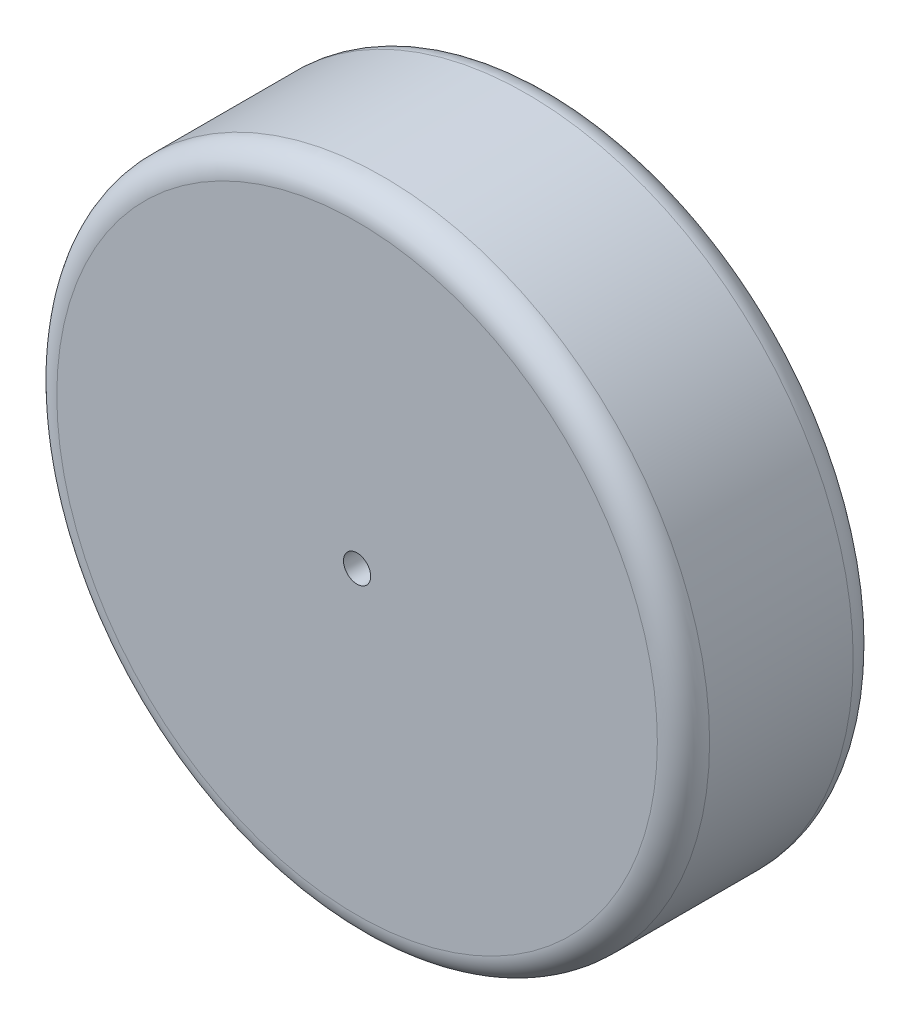
ISO-10303-21;
HEADER;
FILE_DESCRIPTION(('STEP AP214'),'2;1');
FILE_NAME('part.step','',(''),(''),'','','');
FILE_SCHEMA(('AUTOMOTIVE_DESIGN { 1 0 10303 214 1 1 1 1 }'));
ENDSEC;
DATA;
#1=APPLICATION_CONTEXT('core data for automotive mechanical design processes');
#2=APPLICATION_PROTOCOL_DEFINITION('international standard','automotive_design',2000,#1);
#3=PRODUCT_CONTEXT('',#1,'mechanical');
#4=PRODUCT('Part','Part','',(#3));
#5=PRODUCT_RELATED_PRODUCT_CATEGORY('part','',(#4));
#6=PRODUCT_DEFINITION_FORMATION('','',#4);
#7=PRODUCT_DEFINITION_CONTEXT('part definition',#1,'design');
#8=PRODUCT_DEFINITION('design','',#6,#7);
#9=PRODUCT_DEFINITION_SHAPE('','',#8);
#10=(LENGTH_UNIT() NAMED_UNIT(*) SI_UNIT(.MILLI.,.METRE.));
#11=(NAMED_UNIT(*) PLANE_ANGLE_UNIT() SI_UNIT($,.RADIAN.));
#12=(NAMED_UNIT(*) SI_UNIT($,.STERADIAN.) SOLID_ANGLE_UNIT());
#13=UNCERTAINTY_MEASURE_WITH_UNIT(LENGTH_MEASURE(1.E-05),#10,'distance_accuracy_value','');
#14=(GEOMETRIC_REPRESENTATION_CONTEXT(3) GLOBAL_UNCERTAINTY_ASSIGNED_CONTEXT((#13)) GLOBAL_UNIT_ASSIGNED_CONTEXT((#10,
#11,#12)) REPRESENTATION_CONTEXT('',''));
#15=CARTESIAN_POINT('',(0.,0.,0.));
#16=DIRECTION('',(0.,0.,1.));
#17=DIRECTION('',(1.,0.,0.));
#18=AXIS2_PLACEMENT_3D('',#15,#16,#17);
#19=CARTESIAN_POINT('',(0.,0.,15.));
#20=DIRECTION('',(0.,0.,-1.));
#21=DIRECTION('',(-1.,0.,0.));
#22=AXIS2_PLACEMENT_3D('',#19,#20,#21);
#23=CYLINDRICAL_SURFACE('',#22,25.);
#24=CARTESIAN_POINT('',(0.,0.,13.));
#25=DIRECTION('',(0.,0.,1.));
#26=DIRECTION('',(1.,0.,0.));
#27=AXIS2_PLACEMENT_3D('',#24,#25,#26);
#28=CIRCLE('',#27,25.);
#29=CARTESIAN_POINT('',(25.,0.,13.));
#30=VERTEX_POINT('',#29);
#31=EDGE_CURVE('E48',#30,#30,#28,.F.);
#32=ORIENTED_EDGE('',*,*,#31,.T.);
#33=EDGE_LOOP('',(#32));
#34=FACE_BOUND('',#33,.T.);
#35=CARTESIAN_POINT('',(0.,0.,2.));
#36=DIRECTION('',(0.,0.,1.));
#37=DIRECTION('',(1.,0.,0.));
#38=AXIS2_PLACEMENT_3D('',#35,#36,#37);
#39=CIRCLE('',#38,25.);
#40=CARTESIAN_POINT('',(25.,0.,2.));
#41=VERTEX_POINT('',#40);
#42=EDGE_CURVE('E52',#41,#41,#39,.T.);
#43=ORIENTED_EDGE('',*,*,#42,.T.);
#44=EDGE_LOOP('',(#43));
#45=FACE_BOUND('',#44,.T.);
#46=ADVANCED_FACE('F41',(#34,#45),#23,.T.);
#47=CARTESIAN_POINT('',(0.,0.,15.));
#48=DIRECTION('',(0.,0.,1.));
#49=DIRECTION('',(1.,0.,0.));
#50=AXIS2_PLACEMENT_3D('',#47,#48,#49);
#51=PLANE('',#50);
#52=CARTESIAN_POINT('',(0.,0.,15.));
#53=DIRECTION('',(0.,0.,1.));
#54=DIRECTION('',(1.,0.,0.));
#55=AXIS2_PLACEMENT_3D('',#52,#53,#54);
#56=CIRCLE('',#55,1.03999999999999);
#57=CARTESIAN_POINT('',(1.03999999999999,0.,15.));
#58=VERTEX_POINT('',#57);
#59=EDGE_CURVE('E62',#58,#58,#56,.T.);
#60=ORIENTED_EDGE('',*,*,#59,.F.);
#61=EDGE_LOOP('',(#60));
#62=FACE_BOUND('',#61,.T.);
#63=CARTESIAN_POINT('',(0.,0.,15.));
#64=DIRECTION('',(0.,0.,1.));
#65=DIRECTION('',(1.,0.,0.));
#66=AXIS2_PLACEMENT_3D('',#63,#64,#65);
#67=CIRCLE('',#66,23.);
#68=CARTESIAN_POINT('',(23.,0.,15.));
#69=VERTEX_POINT('',#68);
#70=EDGE_CURVE('E56',#69,#69,#67,.T.);
#71=ORIENTED_EDGE('',*,*,#70,.T.);
#72=EDGE_LOOP('',(#71));
#73=FACE_BOUND('',#72,.T.);
#74=ADVANCED_FACE('F76',(#62,#73),#51,.T.);
#75=CARTESIAN_POINT('',(0.,0.,0.));
#76=DIRECTION('',(0.,0.,1.));
#77=DIRECTION('',(1.,0.,0.));
#78=AXIS2_PLACEMENT_3D('',#75,#76,#77);
#79=PLANE('',#78);
#80=CARTESIAN_POINT('',(0.,0.,0.));
#81=DIRECTION('',(0.,0.,1.));
#82=DIRECTION('',(1.,0.,0.));
#83=AXIS2_PLACEMENT_3D('',#80,#81,#82);
#84=CIRCLE('',#83,1.03999999999999);
#85=CARTESIAN_POINT('',(1.03999999999999,0.,0.));
#86=VERTEX_POINT('',#85);
#87=EDGE_CURVE('E61',#86,#86,#84,.T.);
#88=ORIENTED_EDGE('',*,*,#87,.T.);
#89=EDGE_LOOP('',(#88));
#90=FACE_BOUND('',#89,.T.);
#91=CARTESIAN_POINT('',(0.,0.,0.));
#92=DIRECTION('',(0.,0.,1.));
#93=DIRECTION('',(1.,0.,0.));
#94=AXIS2_PLACEMENT_3D('',#91,#92,#93);
#95=CIRCLE('',#94,23.);
#96=CARTESIAN_POINT('',(23.,0.,0.));
#97=VERTEX_POINT('',#96);
#98=EDGE_CURVE('E10',#97,#97,#95,.F.);
#99=ORIENTED_EDGE('',*,*,#98,.T.);
#100=EDGE_LOOP('',(#99));
#101=FACE_BOUND('',#100,.T.);
#102=ADVANCED_FACE('F68',(#90,#101),#79,.F.);
#103=CARTESIAN_POINT('',(0.,0.,13.));
#104=DIRECTION('',(0.,0.,1.));
#105=DIRECTION('',(1.,0.,0.));
#106=AXIS2_PLACEMENT_3D('',#103,#104,#105);
#107=TOROIDAL_SURFACE('',#106,23.,2.);
#108=ORIENTED_EDGE('',*,*,#31,.F.);
#109=EDGE_LOOP('',(#108));
#110=FACE_BOUND('',#109,.T.);
#111=ORIENTED_EDGE('',*,*,#70,.F.);
#112=EDGE_LOOP('',(#111));
#113=FACE_BOUND('',#112,.T.);
#114=ADVANCED_FACE('F82',(#110,#113),#107,.T.);
#115=CARTESIAN_POINT('',(0.,0.,2.));
#116=DIRECTION('',(0.,0.,1.));
#117=DIRECTION('',(1.,0.,0.));
#118=AXIS2_PLACEMENT_3D('',#115,#116,#117);
#119=TOROIDAL_SURFACE('',#118,23.,2.);
#120=ORIENTED_EDGE('',*,*,#98,.F.);
#121=EDGE_LOOP('',(#120));
#122=FACE_BOUND('',#121,.T.);
#123=ORIENTED_EDGE('',*,*,#42,.F.);
#124=EDGE_LOOP('',(#123));
#125=FACE_BOUND('',#124,.T.);
#126=ADVANCED_FACE('F43',(#122,#125),#119,.T.);
#127=CARTESIAN_POINT('',(0.,0.,0.));
#128=DIRECTION('',(0.,0.,1.));
#129=DIRECTION('',(1.,0.,0.));
#130=AXIS2_PLACEMENT_3D('',#127,#128,#129);
#131=CYLINDRICAL_SURFACE('',#130,1.03999999999999);
#132=ORIENTED_EDGE('',*,*,#87,.F.);
#133=EDGE_LOOP('',(#132));
#134=FACE_BOUND('',#133,.T.);
#135=ORIENTED_EDGE('',*,*,#59,.T.);
#136=EDGE_LOOP('',(#135));
#137=FACE_BOUND('',#136,.T.);
#138=ADVANCED_FACE('F70',(#134,#137),#131,.F.);
#139=CLOSED_SHELL('',(#46,#74,#102,#114,#126,#138));
#140=MANIFOLD_SOLID_BREP('B2',#139);
#141=ADVANCED_BREP_SHAPE_REPRESENTATION('',(#18,#140),#14);
#142=SHAPE_DEFINITION_REPRESENTATION(#9,#141);
ENDSEC;
END-ISO-10303-21;
